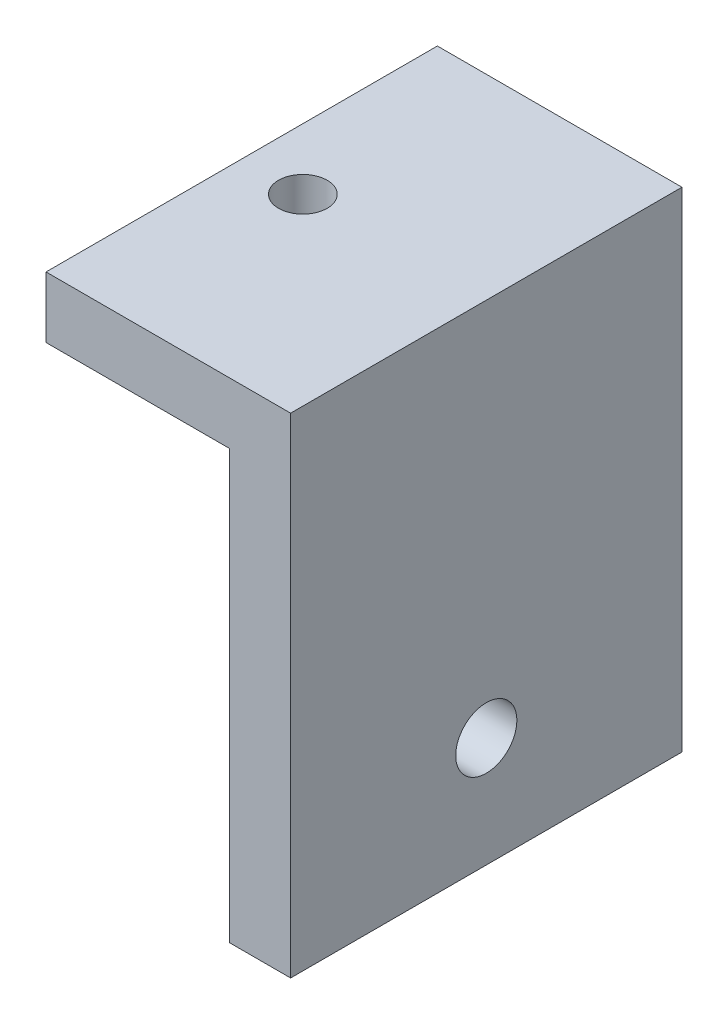
ISO-10303-21;
HEADER;
FILE_DESCRIPTION(('STEP AP214'),'2;1');
FILE_NAME('part.step','',(''),(''),'','','');
FILE_SCHEMA(('AUTOMOTIVE_DESIGN { 1 0 10303 214 1 1 1 1 }'));
ENDSEC;
DATA;
#1=APPLICATION_CONTEXT('core data for automotive mechanical design processes');
#2=APPLICATION_PROTOCOL_DEFINITION('international standard','automotive_design',2000,#1);
#3=PRODUCT_CONTEXT('',#1,'mechanical');
#4=PRODUCT('Part','Part','',(#3));
#5=PRODUCT_RELATED_PRODUCT_CATEGORY('part','',(#4));
#6=PRODUCT_DEFINITION_FORMATION('','',#4);
#7=PRODUCT_DEFINITION_CONTEXT('part definition',#1,'design');
#8=PRODUCT_DEFINITION('design','',#6,#7);
#9=PRODUCT_DEFINITION_SHAPE('','',#8);
#10=(LENGTH_UNIT() NAMED_UNIT(*) SI_UNIT(.MILLI.,.METRE.));
#11=(NAMED_UNIT(*) PLANE_ANGLE_UNIT() SI_UNIT($,.RADIAN.));
#12=(NAMED_UNIT(*) SI_UNIT($,.STERADIAN.) SOLID_ANGLE_UNIT());
#13=UNCERTAINTY_MEASURE_WITH_UNIT(LENGTH_MEASURE(1.E-05),#10,'distance_accuracy_value','');
#14=(GEOMETRIC_REPRESENTATION_CONTEXT(3) GLOBAL_UNCERTAINTY_ASSIGNED_CONTEXT((#13)) GLOBAL_UNIT_ASSIGNED_CONTEXT((#10,
#11,#12)) REPRESENTATION_CONTEXT('',''));
#15=CARTESIAN_POINT('',(0.,0.,0.));
#16=DIRECTION('',(0.,0.,1.));
#17=DIRECTION('',(1.,0.,0.));
#18=AXIS2_PLACEMENT_3D('',#15,#16,#17);
#19=CARTESIAN_POINT('',(-17.3659090909091,21.5272727272727,40.64));
#20=DIRECTION('',(1.,0.,0.));
#21=DIRECTION('',(0.,1.,0.));
#22=AXIS2_PLACEMENT_3D('',#19,#20,#21);
#23=PLANE('',#22);
#24=DIRECTION('',(0.,-1.,0.));
#25=VECTOR('',#24,1.);
#26=CARTESIAN_POINT('',(-17.3659090909091,21.5272727272727,0.));
#27=LINE('',#26,#25);
#28=CARTESIAN_POINT('',(-17.3659090909091,21.5272727272727,0.));
#29=VERTEX_POINT('',#28);
#30=CARTESIAN_POINT('',(-17.3659090909091,15.1772727272727,0.));
#31=VERTEX_POINT('',#30);
#32=EDGE_CURVE('E117',#29,#31,#27,.T.);
#33=ORIENTED_EDGE('',*,*,#32,.T.);
#34=DIRECTION('',(0.,0.,-1.));
#35=VECTOR('',#34,1.);
#36=CARTESIAN_POINT('',(-17.3659090909091,15.1772727272727,40.64));
#37=LINE('',#36,#35);
#38=CARTESIAN_POINT('',(-17.3659090909091,15.1772727272727,40.64));
#39=VERTEX_POINT('',#38);
#40=EDGE_CURVE('E11',#39,#31,#37,.T.);
#41=ORIENTED_EDGE('',*,*,#40,.F.);
#42=DIRECTION('',(0.,-1.,0.));
#43=VECTOR('',#42,1.);
#44=CARTESIAN_POINT('',(-17.3659090909091,21.5272727272727,40.64));
#45=LINE('',#44,#43);
#46=CARTESIAN_POINT('',(-17.3659090909091,21.5272727272727,40.64));
#47=VERTEX_POINT('',#46);
#48=EDGE_CURVE('E128',#47,#39,#45,.T.);
#49=ORIENTED_EDGE('',*,*,#48,.F.);
#50=DIRECTION('',(0.,0.,-1.));
#51=VECTOR('',#50,1.);
#52=CARTESIAN_POINT('',(-17.3659090909091,21.5272727272727,40.64));
#53=LINE('',#52,#51);
#54=EDGE_CURVE('E113',#47,#29,#53,.T.);
#55=ORIENTED_EDGE('',*,*,#54,.T.);
#56=EDGE_LOOP('',(#33,#41,#49,#55));
#57=FACE_BOUND('',#56,.T.);
#58=ADVANCED_FACE('F33',(#57),#23,.F.);
#59=CARTESIAN_POINT('',(-17.3659090909091,15.1772727272727,40.64));
#60=DIRECTION('',(0.,1.,0.));
#61=DIRECTION('',(0.,0.,1.));
#62=AXIS2_PLACEMENT_3D('',#59,#60,#61);
#63=PLANE('',#62);
#64=CARTESIAN_POINT('',(-11.0159090909091,15.1772727272727,20.32));
#65=DIRECTION('',(0.,1.,0.));
#66=DIRECTION('',(0.,0.,1.));
#67=AXIS2_PLACEMENT_3D('',#64,#65,#66);
#68=CIRCLE('',#67,2.52729999999999);
#69=CARTESIAN_POINT('',(-11.0159090909091,15.1772727272727,22.8473));
#70=VERTEX_POINT('',#69);
#71=EDGE_CURVE('E229',#70,#70,#68,.T.);
#72=ORIENTED_EDGE('',*,*,#71,.T.);
#73=EDGE_LOOP('',(#72));
#74=FACE_BOUND('',#73,.T.);
#75=DIRECTION('',(1.,0.,0.));
#76=VECTOR('',#75,1.);
#77=CARTESIAN_POINT('',(-17.3659090909091,15.1772727272727,0.));
#78=LINE('',#77,#76);
#79=CARTESIAN_POINT('',(1.68409090909091,15.1772727272727,0.));
#80=VERTEX_POINT('',#79);
#81=EDGE_CURVE('E120',#31,#80,#78,.T.);
#82=ORIENTED_EDGE('',*,*,#81,.T.);
#83=DIRECTION('',(0.,0.,-1.));
#84=VECTOR('',#83,1.);
#85=CARTESIAN_POINT('',(1.68409090909091,15.1772727272727,40.64));
#86=LINE('',#85,#84);
#87=CARTESIAN_POINT('',(1.68409090909091,15.1772727272727,40.64));
#88=VERTEX_POINT('',#87);
#89=EDGE_CURVE('E41',#88,#80,#86,.T.);
#90=ORIENTED_EDGE('',*,*,#89,.F.);
#91=DIRECTION('',(1.,0.,0.));
#92=VECTOR('',#91,1.);
#93=CARTESIAN_POINT('',(-17.3659090909091,15.1772727272727,40.64));
#94=LINE('',#93,#92);
#95=EDGE_CURVE('E85',#39,#88,#94,.T.);
#96=ORIENTED_EDGE('',*,*,#95,.F.);
#97=ORIENTED_EDGE('',*,*,#40,.T.);
#98=EDGE_LOOP('',(#82,#90,#96,#97));
#99=FACE_BOUND('',#98,.T.);
#100=ADVANCED_FACE('F155',(#74,#99),#63,.F.);
#101=CARTESIAN_POINT('',(1.68409090909091,15.1772727272727,40.64));
#102=DIRECTION('',(1.,0.,0.));
#103=DIRECTION('',(0.,1.,0.));
#104=AXIS2_PLACEMENT_3D('',#101,#102,#103);
#105=PLANE('',#104);
#106=CARTESIAN_POINT('',(1.68409090909091,-17.8427272727273,20.32));
#107=DIRECTION('',(1.,0.,0.));
#108=DIRECTION('',(0.,1.,0.));
#109=AXIS2_PLACEMENT_3D('',#106,#107,#108);
#110=CIRCLE('',#109,3.175);
#111=CARTESIAN_POINT('',(1.68409090909091,-14.6677272727273,20.32));
#112=VERTEX_POINT('',#111);
#113=EDGE_CURVE('E121',#112,#112,#110,.T.);
#114=ORIENTED_EDGE('',*,*,#113,.T.);
#115=EDGE_LOOP('',(#114));
#116=FACE_BOUND('',#115,.T.);
#117=DIRECTION('',(0.,-1.,0.));
#118=VECTOR('',#117,1.);
#119=CARTESIAN_POINT('',(1.68409090909091,15.1772727272727,0.));
#120=LINE('',#119,#118);
#121=CARTESIAN_POINT('',(1.68409090909091,-29.2727272727273,0.));
#122=VERTEX_POINT('',#121);
#123=EDGE_CURVE('E123',#80,#122,#120,.T.);
#124=ORIENTED_EDGE('',*,*,#123,.T.);
#125=DIRECTION('',(0.,0.,-1.));
#126=VECTOR('',#125,1.);
#127=CARTESIAN_POINT('',(1.68409090909091,-29.2727272727273,40.64));
#128=LINE('',#127,#126);
#129=CARTESIAN_POINT('',(1.68409090909091,-29.2727272727273,40.64));
#130=VERTEX_POINT('',#129);
#131=EDGE_CURVE('E108',#130,#122,#128,.T.);
#132=ORIENTED_EDGE('',*,*,#131,.F.);
#133=DIRECTION('',(0.,-1.,0.));
#134=VECTOR('',#133,1.);
#135=CARTESIAN_POINT('',(1.68409090909091,15.1772727272727,40.64));
#136=LINE('',#135,#134);
#137=EDGE_CURVE('E98',#88,#130,#136,.T.);
#138=ORIENTED_EDGE('',*,*,#137,.F.);
#139=ORIENTED_EDGE('',*,*,#89,.T.);
#140=EDGE_LOOP('',(#124,#132,#138,#139));
#141=FACE_BOUND('',#140,.T.);
#142=ADVANCED_FACE('F134',(#116,#141),#105,.F.);
#143=CARTESIAN_POINT('',(8.03409090909091,-29.2727272727273,40.64));
#144=DIRECTION('',(0.,1.,0.));
#145=DIRECTION('',(0.,0.,1.));
#146=AXIS2_PLACEMENT_3D('',#143,#144,#145);
#147=PLANE('',#146);
#148=DIRECTION('',(1.,0.,0.));
#149=VECTOR('',#148,1.);
#150=CARTESIAN_POINT('',(8.03409090909091,-29.2727272727273,0.));
#151=LINE('',#150,#149);
#152=CARTESIAN_POINT('',(8.03409090909091,-29.2727272727273,0.));
#153=VERTEX_POINT('',#152);
#154=EDGE_CURVE('E107',#122,#153,#151,.T.);
#155=ORIENTED_EDGE('',*,*,#154,.T.);
#156=DIRECTION('',(0.,0.,-1.));
#157=VECTOR('',#156,1.);
#158=CARTESIAN_POINT('',(8.03409090909091,-29.2727272727273,40.64));
#159=LINE('',#158,#157);
#160=CARTESIAN_POINT('',(8.03409090909091,-29.2727272727273,40.64));
#161=VERTEX_POINT('',#160);
#162=EDGE_CURVE('E104',#161,#153,#159,.T.);
#163=ORIENTED_EDGE('',*,*,#162,.F.);
#164=DIRECTION('',(1.,0.,0.));
#165=VECTOR('',#164,1.);
#166=CARTESIAN_POINT('',(8.03409090909091,-29.2727272727273,40.64));
#167=LINE('',#166,#165);
#168=EDGE_CURVE('E92',#130,#161,#167,.T.);
#169=ORIENTED_EDGE('',*,*,#168,.F.);
#170=ORIENTED_EDGE('',*,*,#131,.T.);
#171=EDGE_LOOP('',(#155,#163,#169,#170));
#172=FACE_BOUND('',#171,.T.);
#173=ADVANCED_FACE('F105',(#172),#147,.F.);
#174=CARTESIAN_POINT('',(8.03409090909091,21.5272727272727,40.64));
#175=DIRECTION('',(-1.,0.,0.));
#176=DIRECTION('',(0.,0.,1.));
#177=AXIS2_PLACEMENT_3D('',#174,#175,#176);
#178=PLANE('',#177);
#179=CARTESIAN_POINT('',(8.03409090909091,-17.8427272727273,20.32));
#180=DIRECTION('',(1.,0.,0.));
#181=DIRECTION('',(0.,0.,-1.));
#182=AXIS2_PLACEMENT_3D('',#179,#180,#181);
#183=CIRCLE('',#182,3.175);
#184=CARTESIAN_POINT('',(8.03409090909091,-17.8427272727273,17.145));
#185=VERTEX_POINT('',#184);
#186=EDGE_CURVE('E230',#185,#185,#183,.T.);
#187=ORIENTED_EDGE('',*,*,#186,.F.);
#188=EDGE_LOOP('',(#187));
#189=FACE_BOUND('',#188,.T.);
#190=DIRECTION('',(0.,1.,0.));
#191=VECTOR('',#190,1.);
#192=CARTESIAN_POINT('',(8.03409090909091,21.5272727272727,0.));
#193=LINE('',#192,#191);
#194=CARTESIAN_POINT('',(8.03409090909091,21.5272727272727,0.));
#195=VERTEX_POINT('',#194);
#196=EDGE_CURVE('E71',#153,#195,#193,.T.);
#197=ORIENTED_EDGE('',*,*,#196,.T.);
#198=DIRECTION('',(0.,0.,-1.));
#199=VECTOR('',#198,1.);
#200=CARTESIAN_POINT('',(8.03409090909091,21.5272727272727,40.64));
#201=LINE('',#200,#199);
#202=CARTESIAN_POINT('',(8.03409090909091,21.5272727272727,40.64));
#203=VERTEX_POINT('',#202);
#204=EDGE_CURVE('E109',#203,#195,#201,.T.);
#205=ORIENTED_EDGE('',*,*,#204,.F.);
#206=DIRECTION('',(0.,1.,0.));
#207=VECTOR('',#206,1.);
#208=CARTESIAN_POINT('',(8.03409090909091,12.5659090909091,40.64));
#209=LINE('',#208,#207);
#210=EDGE_CURVE('E96',#161,#203,#209,.T.);
#211=ORIENTED_EDGE('',*,*,#210,.F.);
#212=ORIENTED_EDGE('',*,*,#162,.T.);
#213=EDGE_LOOP('',(#197,#205,#211,#212));
#214=FACE_BOUND('',#213,.T.);
#215=ADVANCED_FACE('F111',(#189,#214),#178,.F.);
#216=CARTESIAN_POINT('',(-17.3659090909091,21.5272727272727,40.64));
#217=DIRECTION('',(0.,-1.,0.));
#218=DIRECTION('',(0.,0.,-1.));
#219=AXIS2_PLACEMENT_3D('',#216,#217,#218);
#220=PLANE('',#219);
#221=CARTESIAN_POINT('',(-11.0159090909091,21.5272727272727,20.32));
#222=DIRECTION('',(0.,1.,0.));
#223=DIRECTION('',(0.,0.,1.));
#224=AXIS2_PLACEMENT_3D('',#221,#222,#223);
#225=CIRCLE('',#224,2.52729999999999);
#226=CARTESIAN_POINT('',(-11.0159090909091,21.5272727272727,22.8473));
#227=VERTEX_POINT('',#226);
#228=EDGE_CURVE('E227',#227,#227,#225,.T.);
#229=ORIENTED_EDGE('',*,*,#228,.F.);
#230=EDGE_LOOP('',(#229));
#231=FACE_BOUND('',#230,.T.);
#232=DIRECTION('',(-1.,0.,0.));
#233=VECTOR('',#232,1.);
#234=CARTESIAN_POINT('',(-17.3659090909091,21.5272727272727,0.));
#235=LINE('',#234,#233);
#236=EDGE_CURVE('E77',#195,#29,#235,.T.);
#237=ORIENTED_EDGE('',*,*,#236,.T.);
#238=ORIENTED_EDGE('',*,*,#54,.F.);
#239=DIRECTION('',(-1.,0.,0.));
#240=VECTOR('',#239,1.);
#241=CARTESIAN_POINT('',(-17.3659090909091,21.5272727272727,40.64));
#242=LINE('',#241,#240);
#243=EDGE_CURVE('E49',#203,#47,#242,.T.);
#244=ORIENTED_EDGE('',*,*,#243,.F.);
#245=ORIENTED_EDGE('',*,*,#204,.T.);
#246=EDGE_LOOP('',(#237,#238,#244,#245));
#247=FACE_BOUND('',#246,.T.);
#248=ADVANCED_FACE('F141',(#231,#247),#220,.F.);
#249=CARTESIAN_POINT('',(0.,0.,40.64));
#250=DIRECTION('',(0.,0.,1.));
#251=DIRECTION('',(1.,0.,0.));
#252=AXIS2_PLACEMENT_3D('',#249,#250,#251);
#253=PLANE('',#252);
#254=ORIENTED_EDGE('',*,*,#48,.T.);
#255=ORIENTED_EDGE('',*,*,#95,.T.);
#256=ORIENTED_EDGE('',*,*,#137,.T.);
#257=ORIENTED_EDGE('',*,*,#168,.T.);
#258=ORIENTED_EDGE('',*,*,#210,.T.);
#259=ORIENTED_EDGE('',*,*,#243,.T.);
#260=EDGE_LOOP('',(#254,#255,#256,#257,#258,#259));
#261=FACE_BOUND('',#260,.T.);
#262=ADVANCED_FACE('F94',(#261),#253,.T.);
#263=CARTESIAN_POINT('',(0.,0.,0.));
#264=DIRECTION('',(0.,0.,1.));
#265=DIRECTION('',(1.,0.,0.));
#266=AXIS2_PLACEMENT_3D('',#263,#264,#265);
#267=PLANE('',#266);
#268=ORIENTED_EDGE('',*,*,#32,.F.);
#269=ORIENTED_EDGE('',*,*,#236,.F.);
#270=ORIENTED_EDGE('',*,*,#196,.F.);
#271=ORIENTED_EDGE('',*,*,#154,.F.);
#272=ORIENTED_EDGE('',*,*,#123,.F.);
#273=ORIENTED_EDGE('',*,*,#81,.F.);
#274=EDGE_LOOP('',(#268,#269,#270,#271,#272,#273));
#275=FACE_BOUND('',#274,.T.);
#276=ADVANCED_FACE('F137',(#275),#267,.F.);
#277=CARTESIAN_POINT('',(8.03409090909091,-17.8427272727273,20.32));
#278=DIRECTION('',(1.,0.,0.));
#279=DIRECTION('',(0.,0.,-1.));
#280=AXIS2_PLACEMENT_3D('',#277,#278,#279);
#281=CYLINDRICAL_SURFACE('',#280,3.175);
#282=ORIENTED_EDGE('',*,*,#186,.T.);
#283=EDGE_LOOP('',(#282));
#284=FACE_BOUND('',#283,.T.);
#285=ORIENTED_EDGE('',*,*,#113,.F.);
#286=EDGE_LOOP('',(#285));
#287=FACE_BOUND('',#286,.T.);
#288=ADVANCED_FACE('F187',(#284,#287),#281,.F.);
#289=CARTESIAN_POINT('',(-11.0159090909091,21.5272727272727,20.32));
#290=DIRECTION('',(0.,1.,0.));
#291=DIRECTION('',(0.,0.,1.));
#292=AXIS2_PLACEMENT_3D('',#289,#290,#291);
#293=CYLINDRICAL_SURFACE('',#292,2.52729999999999);
#294=ORIENTED_EDGE('',*,*,#228,.T.);
#295=EDGE_LOOP('',(#294));
#296=FACE_BOUND('',#295,.T.);
#297=ORIENTED_EDGE('',*,*,#71,.F.);
#298=EDGE_LOOP('',(#297));
#299=FACE_BOUND('',#298,.T.);
#300=ADVANCED_FACE('F191',(#296,#299),#293,.F.);
#301=CLOSED_SHELL('',(#58,#100,#142,#173,#215,#248,#262,#276,#288,#300));
#302=MANIFOLD_SOLID_BREP('B2',#301);
#303=ADVANCED_BREP_SHAPE_REPRESENTATION('',(#18,#302),#14);
#304=SHAPE_DEFINITION_REPRESENTATION(#9,#303);
ENDSEC;
END-ISO-10303-21;
